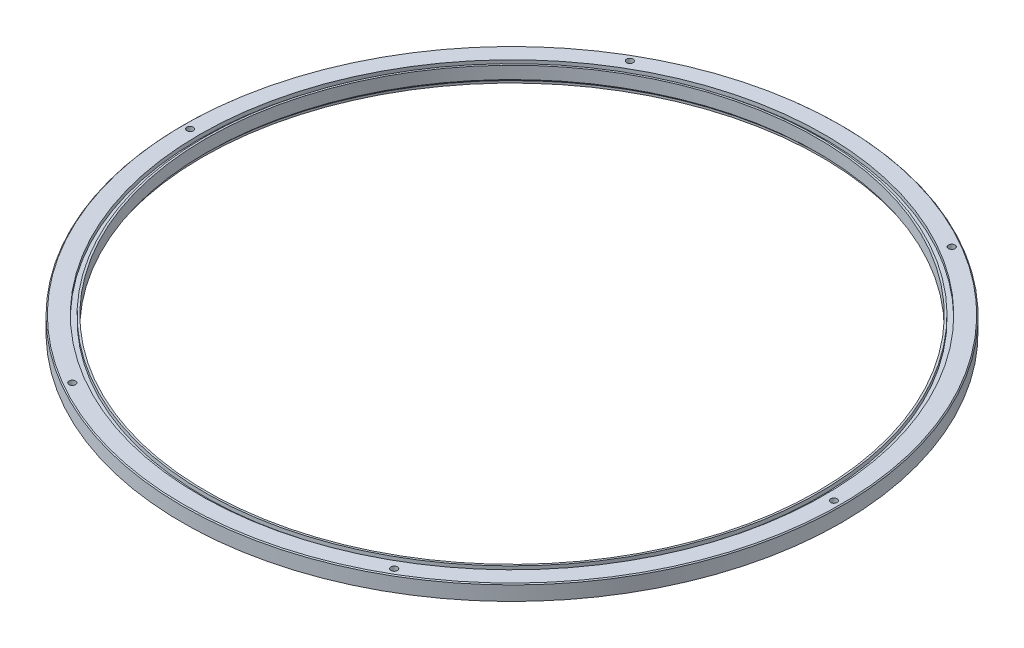
ISO-10303-21;
HEADER;
FILE_DESCRIPTION(('STEP AP214'),'2;1');
FILE_NAME('part.step','',(''),(''),'','','');
FILE_SCHEMA(('AUTOMOTIVE_DESIGN { 1 0 10303 214 1 1 1 1 }'));
ENDSEC;
DATA;
#1=APPLICATION_CONTEXT('core data for automotive mechanical design processes');
#2=APPLICATION_PROTOCOL_DEFINITION('international standard','automotive_design',2000,#1);
#3=PRODUCT_CONTEXT('',#1,'mechanical');
#4=PRODUCT('Part','Part','',(#3));
#5=PRODUCT_RELATED_PRODUCT_CATEGORY('part','',(#4));
#6=PRODUCT_DEFINITION_FORMATION('','',#4);
#7=PRODUCT_DEFINITION_CONTEXT('part definition',#1,'design');
#8=PRODUCT_DEFINITION('design','',#6,#7);
#9=PRODUCT_DEFINITION_SHAPE('','',#8);
#10=(LENGTH_UNIT() NAMED_UNIT(*) SI_UNIT(.MILLI.,.METRE.));
#11=(NAMED_UNIT(*) PLANE_ANGLE_UNIT() SI_UNIT($,.RADIAN.));
#12=(NAMED_UNIT(*) SI_UNIT($,.STERADIAN.) SOLID_ANGLE_UNIT());
#13=UNCERTAINTY_MEASURE_WITH_UNIT(LENGTH_MEASURE(1.E-05),#10,'distance_accuracy_value','');
#14=(GEOMETRIC_REPRESENTATION_CONTEXT(3) GLOBAL_UNCERTAINTY_ASSIGNED_CONTEXT((#13)) GLOBAL_UNIT_ASSIGNED_CONTEXT((#10,
#11,#12)) REPRESENTATION_CONTEXT('',''));
#15=CARTESIAN_POINT('',(0.,0.,0.));
#16=DIRECTION('',(0.,0.,1.));
#17=DIRECTION('',(1.,0.,0.));
#18=AXIS2_PLACEMENT_3D('',#15,#16,#17);
#19=CARTESIAN_POINT('',(0.,-0.95,0.));
#20=DIRECTION('',(0.,1.,0.));
#21=DIRECTION('',(1.,0.,0.));
#22=AXIS2_PLACEMENT_3D('',#19,#20,#21);
#23=CYLINDRICAL_SURFACE('',#22,345.);
#24=CARTESIAN_POINT('',(0.,18.00000000001,0.));
#25=DIRECTION('',(0.,1.,0.));
#26=DIRECTION('',(1.,0.,0.));
#27=AXIS2_PLACEMENT_3D('',#24,#25,#26);
#28=CIRCLE('',#27,345.);
#29=CARTESIAN_POINT('',(-345.,18.00000000001,0.));
#30=VERTEX_POINT('',#29);
#31=CARTESIAN_POINT('',(-1.20188274546653E-13,17.9999999999891,344.999999999979));
#32=VERTEX_POINT('',#31);
#33=EDGE_CURVE('E217',#30,#32,#28,.T.);
#34=ORIENTED_EDGE('',*,*,#33,.F.);
#35=DIRECTION('',(0.,-1.,0.));
#36=VECTOR('',#35,1.);
#37=CARTESIAN_POINT('',(-345.,-0.95,0.));
#38=LINE('',#37,#36);
#39=CARTESIAN_POINT('',(-345.,3.,0.));
#40=VERTEX_POINT('',#39);
#41=EDGE_CURVE('E11',#30,#40,#38,.T.);
#42=ORIENTED_EDGE('',*,*,#41,.T.);
#43=CARTESIAN_POINT('',(0.,3.,0.));
#44=DIRECTION('',(0.,-1.,0.));
#45=DIRECTION('',(1.,0.,0.));
#46=AXIS2_PLACEMENT_3D('',#43,#44,#45);
#47=CIRCLE('',#46,345.);
#48=EDGE_CURVE('E207',#40,#40,#47,.T.);
#49=ORIENTED_EDGE('',*,*,#48,.F.);
#50=ORIENTED_EDGE('',*,*,#41,.F.);
#51=CARTESIAN_POINT('',(0.,18.00000000001,0.));
#52=DIRECTION('',(0.,1.,0.));
#53=DIRECTION('',(1.,0.,0.));
#54=AXIS2_PLACEMENT_3D('',#51,#52,#53);
#55=CIRCLE('',#54,345.);
#56=EDGE_CURVE('E28',#32,#30,#55,.T.);
#57=ORIENTED_EDGE('',*,*,#56,.F.);
#58=EDGE_LOOP('',(#34,#42,#49,#50,#57));
#59=FACE_BOUND('',#58,.T.);
#60=ADVANCED_FACE('F17',(#59),#23,.T.);
#61=CARTESIAN_POINT('',(0.,18.50000000088,-1.181814550022E-11));
#62=DIRECTION('',(0.,-1.,0.));
#63=DIRECTION('',(0.,0.,-1.));
#64=AXIS2_PLACEMENT_3D('',#61,#62,#63);
#65=CONICAL_SURFACE('',#64,344.4999999991,0.785398163397448);
#66=ORIENTED_EDGE('',*,*,#33,.T.);
#67=DIRECTION('',(0.,0.707106781186548,-0.707106781186548));
#68=VECTOR('',#67,1.);
#69=CARTESIAN_POINT('',(-1.20127042206586E-13,18.50000000088,344.499999999088));
#70=LINE('',#69,#68);
#71=CARTESIAN_POINT('',(-1.20065809866738E-13,18.9999999999901,343.999999999978));
#72=VERTEX_POINT('',#71);
#73=EDGE_CURVE('E220',#32,#72,#70,.T.);
#74=ORIENTED_EDGE('',*,*,#73,.T.);
#75=CARTESIAN_POINT('',(0.,19.,-1.181814550022E-11));
#76=DIRECTION('',(0.,1.,0.));
#77=DIRECTION('',(1.,0.,0.));
#78=AXIS2_PLACEMENT_3D('',#75,#76,#77);
#79=CIRCLE('',#78,344.);
#80=EDGE_CURVE('E209',#72,#72,#79,.T.);
#81=ORIENTED_EDGE('',*,*,#80,.F.);
#82=ORIENTED_EDGE('',*,*,#73,.F.);
#83=ORIENTED_EDGE('',*,*,#56,.T.);
#84=EDGE_LOOP('',(#66,#74,#81,#82,#83));
#85=FACE_BOUND('',#84,.T.);
#86=ADVANCED_FACE('F417',(#85),#65,.T.);
#87=CARTESIAN_POINT('',(168.5,-2.945,291.8505610754));
#88=DIRECTION('',(0.,1.,0.));
#89=DIRECTION('',(0.500000000000017,0.,0.866025403784429));
#90=AXIS2_PLACEMENT_3D('',#87,#88,#89);
#91=CYLINDRICAL_SURFACE('',#90,3.4);
#92=CARTESIAN_POINT('',(168.5,3.,291.8505610754));
#93=DIRECTION('',(0.,1.,0.));
#94=DIRECTION('',(0.500000000000017,0.,0.866025403784429));
#95=AXIS2_PLACEMENT_3D('',#92,#93,#94);
#96=CIRCLE('',#95,3.4);
#97=CARTESIAN_POINT('',(166.8,3.,288.9060747025));
#98=VERTEX_POINT('',#97);
#99=EDGE_CURVE('E245',#98,#98,#96,.T.);
#100=ORIENTED_EDGE('',*,*,#99,.F.);
#101=DIRECTION('',(0.,1.,0.));
#102=VECTOR('',#101,1.);
#103=CARTESIAN_POINT('',(166.8,-2.945,288.906074702533));
#104=LINE('',#103,#102);
#105=CARTESIAN_POINT('',(166.8,19.,288.9060747025));
#106=VERTEX_POINT('',#105);
#107=EDGE_CURVE('E221',#98,#106,#104,.T.);
#108=ORIENTED_EDGE('',*,*,#107,.T.);
#109=CARTESIAN_POINT('',(168.5,19.,291.8505610754));
#110=DIRECTION('',(0.,1.,0.));
#111=DIRECTION('',(0.500000000000017,0.,0.866025403784429));
#112=AXIS2_PLACEMENT_3D('',#109,#110,#111);
#113=CIRCLE('',#112,3.4);
#114=EDGE_CURVE('E203',#106,#106,#113,.T.);
#115=ORIENTED_EDGE('',*,*,#114,.T.);
#116=ORIENTED_EDGE('',*,*,#107,.F.);
#117=EDGE_LOOP('',(#100,#108,#115,#116));
#118=FACE_BOUND('',#117,.T.);
#119=ADVANCED_FACE('F455',(#118),#91,.F.);
#120=CARTESIAN_POINT('',(-168.5,-2.945,291.8505610754));
#121=DIRECTION('',(0.,1.,0.));
#122=DIRECTION('',(-0.500000000000017,0.,0.866025403784429));
#123=AXIS2_PLACEMENT_3D('',#120,#121,#122);
#124=CYLINDRICAL_SURFACE('',#123,3.4);
#125=CARTESIAN_POINT('',(-168.5,3.,291.8505610754));
#126=DIRECTION('',(0.,1.,0.));
#127=DIRECTION('',(-0.500000000000017,0.,0.866025403784429));
#128=AXIS2_PLACEMENT_3D('',#125,#126,#127);
#129=CIRCLE('',#128,3.4);
#130=CARTESIAN_POINT('',(-166.8,3.,288.9060747025));
#131=VERTEX_POINT('',#130);
#132=EDGE_CURVE('E241',#131,#131,#129,.T.);
#133=ORIENTED_EDGE('',*,*,#132,.F.);
#134=DIRECTION('',(0.,1.,0.));
#135=VECTOR('',#134,1.);
#136=CARTESIAN_POINT('',(-166.8,-2.945,288.906074702533));
#137=LINE('',#136,#135);
#138=CARTESIAN_POINT('',(-166.8,19.,288.9060747025));
#139=VERTEX_POINT('',#138);
#140=EDGE_CURVE('E228',#131,#139,#137,.T.);
#141=ORIENTED_EDGE('',*,*,#140,.T.);
#142=CARTESIAN_POINT('',(-168.5,19.,291.8505610754));
#143=DIRECTION('',(0.,1.,0.));
#144=DIRECTION('',(-0.500000000000017,0.,0.866025403784429));
#145=AXIS2_PLACEMENT_3D('',#142,#143,#144);
#146=CIRCLE('',#145,3.4);
#147=EDGE_CURVE('E199',#139,#139,#146,.T.);
#148=ORIENTED_EDGE('',*,*,#147,.T.);
#149=ORIENTED_EDGE('',*,*,#140,.F.);
#150=EDGE_LOOP('',(#133,#141,#148,#149));
#151=FACE_BOUND('',#150,.T.);
#152=ADVANCED_FACE('F377',(#151),#124,.F.);
#153=CARTESIAN_POINT('',(-337.,-2.945,0.));
#154=DIRECTION('',(0.,1.,0.));
#155=DIRECTION('',(-1.,0.,0.));
#156=AXIS2_PLACEMENT_3D('',#153,#154,#155);
#157=CYLINDRICAL_SURFACE('',#156,3.4);
#158=CARTESIAN_POINT('',(-337.,3.,0.));
#159=DIRECTION('',(0.,1.,0.));
#160=DIRECTION('',(-1.,0.,0.));
#161=AXIS2_PLACEMENT_3D('',#158,#159,#160);
#162=CIRCLE('',#161,3.4);
#163=CARTESIAN_POINT('',(-333.6,3.,0.));
#164=VERTEX_POINT('',#163);
#165=EDGE_CURVE('E246',#164,#164,#162,.T.);
#166=ORIENTED_EDGE('',*,*,#165,.F.);
#167=DIRECTION('',(0.,1.,0.));
#168=VECTOR('',#167,1.);
#169=CARTESIAN_POINT('',(-333.6,-2.945,0.));
#170=LINE('',#169,#168);
#171=CARTESIAN_POINT('',(-333.6,19.,0.));
#172=VERTEX_POINT('',#171);
#173=EDGE_CURVE('E235',#164,#172,#170,.T.);
#174=ORIENTED_EDGE('',*,*,#173,.T.);
#175=CARTESIAN_POINT('',(-337.,19.,0.));
#176=DIRECTION('',(0.,1.,0.));
#177=DIRECTION('',(-1.,0.,0.));
#178=AXIS2_PLACEMENT_3D('',#175,#176,#177);
#179=CIRCLE('',#178,3.4);
#180=EDGE_CURVE('E191',#172,#172,#179,.T.);
#181=ORIENTED_EDGE('',*,*,#180,.T.);
#182=ORIENTED_EDGE('',*,*,#173,.F.);
#183=EDGE_LOOP('',(#166,#174,#181,#182));
#184=FACE_BOUND('',#183,.T.);
#185=ADVANCED_FACE('F371',(#184),#157,.F.);
#186=CARTESIAN_POINT('',(-168.5,-2.945,-291.8505610754));
#187=DIRECTION('',(0.,1.,0.));
#188=DIRECTION('',(-0.500000000000017,0.,-0.866025403784429));
#189=AXIS2_PLACEMENT_3D('',#186,#187,#188);
#190=CYLINDRICAL_SURFACE('',#189,3.4);
#191=CARTESIAN_POINT('',(-168.5,3.,-291.8505610754));
#192=DIRECTION('',(0.,1.,0.));
#193=DIRECTION('',(-0.500000000000017,0.,-0.866025403784429));
#194=AXIS2_PLACEMENT_3D('',#191,#192,#193);
#195=CIRCLE('',#194,3.4);
#196=CARTESIAN_POINT('',(-166.8,3.,-288.9060747025));
#197=VERTEX_POINT('',#196);
#198=EDGE_CURVE('E264',#197,#197,#195,.T.);
#199=ORIENTED_EDGE('',*,*,#198,.F.);
#200=DIRECTION('',(0.,1.,0.));
#201=VECTOR('',#200,1.);
#202=CARTESIAN_POINT('',(-166.8,-2.945,-288.906074702533));
#203=LINE('',#202,#201);
#204=CARTESIAN_POINT('',(-166.8,19.,-288.9060747025));
#205=VERTEX_POINT('',#204);
#206=EDGE_CURVE('E257',#197,#205,#203,.T.);
#207=ORIENTED_EDGE('',*,*,#206,.T.);
#208=CARTESIAN_POINT('',(-168.5,19.,-291.8505610754));
#209=DIRECTION('',(0.,1.,0.));
#210=DIRECTION('',(-0.500000000000017,0.,-0.866025403784429));
#211=AXIS2_PLACEMENT_3D('',#208,#209,#210);
#212=CIRCLE('',#211,3.4);
#213=EDGE_CURVE('E188',#205,#205,#212,.T.);
#214=ORIENTED_EDGE('',*,*,#213,.T.);
#215=ORIENTED_EDGE('',*,*,#206,.F.);
#216=EDGE_LOOP('',(#199,#207,#214,#215));
#217=FACE_BOUND('',#216,.T.);
#218=ADVANCED_FACE('F376',(#217),#190,.F.);
#219=CARTESIAN_POINT('',(168.5,-2.945,-291.8505610754));
#220=DIRECTION('',(0.,1.,0.));
#221=DIRECTION('',(0.500000000000017,0.,-0.866025403784429));
#222=AXIS2_PLACEMENT_3D('',#219,#220,#221);
#223=CYLINDRICAL_SURFACE('',#222,3.4);
#224=CARTESIAN_POINT('',(168.5,3.,-291.8505610754));
#225=DIRECTION('',(0.,1.,0.));
#226=DIRECTION('',(0.500000000000017,0.,-0.866025403784429));
#227=AXIS2_PLACEMENT_3D('',#224,#225,#226);
#228=CIRCLE('',#227,3.4);
#229=CARTESIAN_POINT('',(166.8,3.,-288.9060747025));
#230=VERTEX_POINT('',#229);
#231=EDGE_CURVE('E268',#230,#230,#228,.T.);
#232=ORIENTED_EDGE('',*,*,#231,.F.);
#233=DIRECTION('',(0.,1.,0.));
#234=VECTOR('',#233,1.);
#235=CARTESIAN_POINT('',(166.8,-2.945,-288.906074702533));
#236=LINE('',#235,#234);
#237=CARTESIAN_POINT('',(166.8,19.,-288.9060747025));
#238=VERTEX_POINT('',#237);
#239=EDGE_CURVE('E260',#230,#238,#236,.T.);
#240=ORIENTED_EDGE('',*,*,#239,.T.);
#241=CARTESIAN_POINT('',(168.5,19.,-291.8505610754));
#242=DIRECTION('',(0.,1.,0.));
#243=DIRECTION('',(0.500000000000017,0.,-0.866025403784429));
#244=AXIS2_PLACEMENT_3D('',#241,#242,#243);
#245=CIRCLE('',#244,3.4);
#246=EDGE_CURVE('E192',#238,#238,#245,.T.);
#247=ORIENTED_EDGE('',*,*,#246,.T.);
#248=ORIENTED_EDGE('',*,*,#239,.F.);
#249=EDGE_LOOP('',(#232,#240,#247,#248));
#250=FACE_BOUND('',#249,.T.);
#251=ADVANCED_FACE('F364',(#250),#223,.F.);
#252=CARTESIAN_POINT('',(337.,-2.945,0.));
#253=DIRECTION('',(0.,1.,0.));
#254=DIRECTION('',(1.,0.,0.));
#255=AXIS2_PLACEMENT_3D('',#252,#253,#254);
#256=CYLINDRICAL_SURFACE('',#255,3.4);
#257=CARTESIAN_POINT('',(337.,3.,0.));
#258=DIRECTION('',(0.,1.,0.));
#259=DIRECTION('',(1.,0.,0.));
#260=AXIS2_PLACEMENT_3D('',#257,#258,#259);
#261=CIRCLE('',#260,3.4);
#262=CARTESIAN_POINT('',(333.6,3.,0.));
#263=VERTEX_POINT('',#262);
#264=EDGE_CURVE('E186',#263,#263,#261,.T.);
#265=ORIENTED_EDGE('',*,*,#264,.F.);
#266=DIRECTION('',(0.,1.,0.));
#267=VECTOR('',#266,1.);
#268=CARTESIAN_POINT('',(333.6,-2.945,0.));
#269=LINE('',#268,#267);
#270=CARTESIAN_POINT('',(333.6,19.,0.));
#271=VERTEX_POINT('',#270);
#272=EDGE_CURVE('E269',#263,#271,#269,.T.);
#273=ORIENTED_EDGE('',*,*,#272,.T.);
#274=CARTESIAN_POINT('',(337.,19.,0.));
#275=DIRECTION('',(0.,1.,0.));
#276=DIRECTION('',(1.,0.,0.));
#277=AXIS2_PLACEMENT_3D('',#274,#275,#276);
#278=CIRCLE('',#277,3.4);
#279=EDGE_CURVE('E213',#271,#271,#278,.T.);
#280=ORIENTED_EDGE('',*,*,#279,.T.);
#281=ORIENTED_EDGE('',*,*,#272,.F.);
#282=EDGE_LOOP('',(#265,#273,#280,#281));
#283=FACE_BOUND('',#282,.T.);
#284=ADVANCED_FACE('F358',(#283),#256,.F.);
#285=CARTESIAN_POINT('',(0.,19.,0.));
#286=DIRECTION('',(0.,1.,0.));
#287=DIRECTION('',(1.,0.,0.));
#288=AXIS2_PLACEMENT_3D('',#285,#286,#287);
#289=PLANE('',#288);
#290=CARTESIAN_POINT('',(0.,19.,0.));
#291=DIRECTION('',(0.,1.,0.));
#292=DIRECTION('',(1.,0.,0.));
#293=AXIS2_PLACEMENT_3D('',#290,#291,#292);
#294=CIRCLE('',#293,327.);
#295=CARTESIAN_POINT('',(-327.,19.,0.));
#296=VERTEX_POINT('',#295);
#297=EDGE_CURVE('E214',#296,#296,#294,.T.);
#298=ORIENTED_EDGE('',*,*,#297,.F.);
#299=EDGE_LOOP('',(#298));
#300=FACE_BOUND('',#299,.T.);
#301=ORIENTED_EDGE('',*,*,#114,.F.);
#302=EDGE_LOOP('',(#301));
#303=FACE_BOUND('',#302,.T.);
#304=ORIENTED_EDGE('',*,*,#147,.F.);
#305=EDGE_LOOP('',(#304));
#306=FACE_BOUND('',#305,.T.);
#307=ORIENTED_EDGE('',*,*,#180,.F.);
#308=EDGE_LOOP('',(#307));
#309=FACE_BOUND('',#308,.T.);
#310=ORIENTED_EDGE('',*,*,#213,.F.);
#311=EDGE_LOOP('',(#310));
#312=FACE_BOUND('',#311,.T.);
#313=ORIENTED_EDGE('',*,*,#246,.F.);
#314=EDGE_LOOP('',(#313));
#315=FACE_BOUND('',#314,.T.);
#316=ORIENTED_EDGE('',*,*,#279,.F.);
#317=EDGE_LOOP('',(#316));
#318=FACE_BOUND('',#317,.T.);
#319=ORIENTED_EDGE('',*,*,#80,.T.);
#320=EDGE_LOOP('',(#319));
#321=FACE_BOUND('',#320,.T.);
#322=ADVANCED_FACE('F363',(#300,#303,#306,#309,#312,#315,#318,#321),#289,.T.);
#323=CARTESIAN_POINT('',(0.,-0.95,0.));
#324=DIRECTION('',(0.,1.,0.));
#325=DIRECTION('',(1.,0.,0.));
#326=AXIS2_PLACEMENT_3D('',#323,#324,#325);
#327=CYLINDRICAL_SURFACE('',#326,327.);
#328=CARTESIAN_POINT('',(0.,15.,0.));
#329=DIRECTION('',(0.,1.,0.));
#330=DIRECTION('',(1.,0.,0.));
#331=AXIS2_PLACEMENT_3D('',#328,#329,#330);
#332=CIRCLE('',#331,327.);
#333=CARTESIAN_POINT('',(-327.,15.,0.));
#334=VERTEX_POINT('',#333);
#335=EDGE_CURVE('E21',#334,#334,#332,.T.);
#336=ORIENTED_EDGE('',*,*,#335,.F.);
#337=DIRECTION('',(0.,1.,0.));
#338=VECTOR('',#337,1.);
#339=CARTESIAN_POINT('',(-327.,-0.95,0.));
#340=LINE('',#339,#338);
#341=EDGE_CURVE('E240',#334,#296,#340,.T.);
#342=ORIENTED_EDGE('',*,*,#341,.T.);
#343=ORIENTED_EDGE('',*,*,#297,.T.);
#344=ORIENTED_EDGE('',*,*,#341,.F.);
#345=EDGE_LOOP('',(#336,#342,#343,#344));
#346=FACE_BOUND('',#345,.T.);
#347=ADVANCED_FACE('F391',(#346),#327,.F.);
#348=CARTESIAN_POINT('',(0.,15.,0.));
#349=DIRECTION('',(0.,1.,0.));
#350=DIRECTION('',(1.,0.,0.));
#351=AXIS2_PLACEMENT_3D('',#348,#349,#350);
#352=PLANE('',#351);
#353=CARTESIAN_POINT('',(0.,15.,0.));
#354=DIRECTION('',(0.,1.,0.));
#355=DIRECTION('',(1.,0.,0.));
#356=AXIS2_PLACEMENT_3D('',#353,#354,#355);
#357=CIRCLE('',#356,322.);
#358=CARTESIAN_POINT('',(-322.,15.,0.));
#359=VERTEX_POINT('',#358);
#360=EDGE_CURVE('E135',#359,#359,#357,.T.);
#361=ORIENTED_EDGE('',*,*,#360,.F.);
#362=EDGE_LOOP('',(#361));
#363=FACE_BOUND('',#362,.T.);
#364=ORIENTED_EDGE('',*,*,#335,.T.);
#365=EDGE_LOOP('',(#364));
#366=FACE_BOUND('',#365,.T.);
#367=ADVANCED_FACE('F396',(#363,#366),#352,.T.);
#368=CARTESIAN_POINT('',(0.,-0.95,0.));
#369=DIRECTION('',(0.,1.,0.));
#370=DIRECTION('',(1.,0.,0.));
#371=AXIS2_PLACEMENT_3D('',#368,#369,#370);
#372=CYLINDRICAL_SURFACE('',#371,322.);
#373=CARTESIAN_POINT('',(0.,19.,0.));
#374=DIRECTION('',(0.,1.,0.));
#375=DIRECTION('',(1.,0.,0.));
#376=AXIS2_PLACEMENT_3D('',#373,#374,#375);
#377=CIRCLE('',#376,322.);
#378=CARTESIAN_POINT('',(-322.,19.,0.));
#379=VERTEX_POINT('',#378);
#380=EDGE_CURVE('E194',#379,#379,#377,.T.);
#381=ORIENTED_EDGE('',*,*,#380,.F.);
#382=DIRECTION('',(0.,-1.,0.));
#383=VECTOR('',#382,1.);
#384=CARTESIAN_POINT('',(-322.,-0.95,0.));
#385=LINE('',#384,#383);
#386=EDGE_CURVE('E139',#379,#359,#385,.T.);
#387=ORIENTED_EDGE('',*,*,#386,.T.);
#388=ORIENTED_EDGE('',*,*,#360,.T.);
#389=ORIENTED_EDGE('',*,*,#386,.F.);
#390=EDGE_LOOP('',(#381,#387,#388,#389));
#391=FACE_BOUND('',#390,.T.);
#392=ADVANCED_FACE('F443',(#391),#372,.T.);
#393=CARTESIAN_POINT('',(0.,19.,0.));
#394=DIRECTION('',(0.,1.,0.));
#395=DIRECTION('',(1.,0.,0.));
#396=AXIS2_PLACEMENT_3D('',#393,#394,#395);
#397=PLANE('',#396);
#398=CARTESIAN_POINT('',(0.,19.,0.));
#399=DIRECTION('',(0.,1.,0.));
#400=DIRECTION('',(1.,0.,0.));
#401=AXIS2_PLACEMENT_3D('',#398,#399,#400);
#402=CIRCLE('',#401,320.);
#403=CARTESIAN_POINT('',(-320.,19.,0.));
#404=VERTEX_POINT('',#403);
#405=EDGE_CURVE('E150',#404,#404,#402,.T.);
#406=ORIENTED_EDGE('',*,*,#405,.F.);
#407=EDGE_LOOP('',(#406));
#408=FACE_BOUND('',#407,.T.);
#409=ORIENTED_EDGE('',*,*,#380,.T.);
#410=EDGE_LOOP('',(#409));
#411=FACE_BOUND('',#410,.T.);
#412=ADVANCED_FACE('F438',(#408,#411),#397,.T.);
#413=CARTESIAN_POINT('',(0.,-0.95,0.));
#414=DIRECTION('',(0.,1.,0.));
#415=DIRECTION('',(1.,0.,0.));
#416=AXIS2_PLACEMENT_3D('',#413,#414,#415);
#417=CYLINDRICAL_SURFACE('',#416,320.);
#418=CARTESIAN_POINT('',(0.,6.,0.));
#419=DIRECTION('',(0.,1.,0.));
#420=DIRECTION('',(-1.,0.,0.));
#421=AXIS2_PLACEMENT_3D('',#418,#419,#420);
#422=CIRCLE('',#421,320.);
#423=CARTESIAN_POINT('',(0.,5.99999999999906,320.));
#424=VERTEX_POINT('',#423);
#425=CARTESIAN_POINT('',(-320.,6.,0.));
#426=VERTEX_POINT('',#425);
#427=EDGE_CURVE('E165',#424,#426,#422,.T.);
#428=ORIENTED_EDGE('',*,*,#427,.F.);
#429=CARTESIAN_POINT('',(0.,6.,0.));
#430=DIRECTION('',(0.,1.,0.));
#431=DIRECTION('',(-1.,0.,0.));
#432=AXIS2_PLACEMENT_3D('',#429,#430,#431);
#433=CIRCLE('',#432,320.);
#434=EDGE_CURVE('E170',#426,#424,#433,.T.);
#435=ORIENTED_EDGE('',*,*,#434,.F.);
#436=DIRECTION('',(0.,1.,0.));
#437=VECTOR('',#436,1.);
#438=CARTESIAN_POINT('',(-320.,-0.95,0.));
#439=LINE('',#438,#437);
#440=EDGE_CURVE('E169',#426,#404,#439,.T.);
#441=ORIENTED_EDGE('',*,*,#440,.T.);
#442=ORIENTED_EDGE('',*,*,#405,.T.);
#443=ORIENTED_EDGE('',*,*,#440,.F.);
#444=EDGE_LOOP('',(#428,#435,#441,#442,#443));
#445=FACE_BOUND('',#444,.T.);
#446=ADVANCED_FACE('F175',(#445),#417,.F.);
#447=CARTESIAN_POINT('',(0.,4.500000001398,0.));
#448=DIRECTION('',(0.,-1.,0.));
#449=DIRECTION('',(0.,0.,-1.));
#450=AXIS2_PLACEMENT_3D('',#447,#448,#449);
#451=CONICAL_SURFACE('',#450,321.4999999986,0.785398163397448);
#452=ORIENTED_EDGE('',*,*,#427,.T.);
#453=ORIENTED_EDGE('',*,*,#434,.T.);
#454=DIRECTION('',(0.,-0.707106781186548,0.707106781186548));
#455=VECTOR('',#454,1.);
#456=CARTESIAN_POINT('',(0.,4.500000001398,321.4999999986));
#457=LINE('',#456,#455);
#458=CARTESIAN_POINT('',(0.,2.99999999999895,323.));
#459=VERTEX_POINT('',#458);
#460=EDGE_CURVE('E161',#424,#459,#457,.T.);
#461=ORIENTED_EDGE('',*,*,#460,.T.);
#462=CARTESIAN_POINT('',(0.,3.,0.));
#463=DIRECTION('',(0.,1.,0.));
#464=DIRECTION('',(-1.,0.,0.));
#465=AXIS2_PLACEMENT_3D('',#462,#463,#464);
#466=CIRCLE('',#465,323.);
#467=EDGE_CURVE('E167',#459,#459,#466,.T.);
#468=ORIENTED_EDGE('',*,*,#467,.F.);
#469=ORIENTED_EDGE('',*,*,#460,.F.);
#470=EDGE_LOOP('',(#452,#453,#461,#468,#469));
#471=FACE_BOUND('',#470,.T.);
#472=ADVANCED_FACE('F163',(#471),#451,.F.);
#473=CARTESIAN_POINT('',(0.,3.,0.));
#474=DIRECTION('',(0.,1.,0.));
#475=DIRECTION('',(1.,0.,0.));
#476=AXIS2_PLACEMENT_3D('',#473,#474,#475);
#477=PLANE('',#476);
#478=ORIENTED_EDGE('',*,*,#467,.T.);
#479=EDGE_LOOP('',(#478));
#480=FACE_BOUND('',#479,.T.);
#481=CARTESIAN_POINT('',(0.,3.,0.));
#482=DIRECTION('',(0.,1.,0.));
#483=DIRECTION('',(1.,0.,0.));
#484=AXIS2_PLACEMENT_3D('',#481,#482,#483);
#485=CIRCLE('',#484,324.);
#486=CARTESIAN_POINT('',(-324.,3.,0.));
#487=VERTEX_POINT('',#486);
#488=EDGE_CURVE('E182',#487,#487,#485,.T.);
#489=ORIENTED_EDGE('',*,*,#488,.F.);
#490=EDGE_LOOP('',(#489));
#491=FACE_BOUND('',#490,.T.);
#492=ADVANCED_FACE('F347',(#480,#491),#477,.F.);
#493=CARTESIAN_POINT('',(0.,-0.95,0.));
#494=DIRECTION('',(0.,1.,0.));
#495=DIRECTION('',(1.,0.,0.));
#496=AXIS2_PLACEMENT_3D('',#493,#494,#495);
#497=CYLINDRICAL_SURFACE('',#496,324.);
#498=CARTESIAN_POINT('',(0.,0.,0.));
#499=DIRECTION('',(0.,1.,0.));
#500=DIRECTION('',(1.,0.,0.));
#501=AXIS2_PLACEMENT_3D('',#498,#499,#500);
#502=CIRCLE('',#501,324.);
#503=CARTESIAN_POINT('',(-324.,0.,0.));
#504=VERTEX_POINT('',#503);
#505=EDGE_CURVE('E255',#504,#504,#502,.T.);
#506=ORIENTED_EDGE('',*,*,#505,.F.);
#507=DIRECTION('',(0.,1.,0.));
#508=VECTOR('',#507,1.);
#509=CARTESIAN_POINT('',(-324.,-0.95,0.));
#510=LINE('',#509,#508);
#511=EDGE_CURVE('E281',#504,#487,#510,.T.);
#512=ORIENTED_EDGE('',*,*,#511,.T.);
#513=ORIENTED_EDGE('',*,*,#488,.T.);
#514=ORIENTED_EDGE('',*,*,#511,.F.);
#515=EDGE_LOOP('',(#506,#512,#513,#514));
#516=FACE_BOUND('',#515,.T.);
#517=ADVANCED_FACE('F19',(#516),#497,.F.);
#518=CARTESIAN_POINT('',(0.,0.,0.));
#519=DIRECTION('',(0.,1.,0.));
#520=DIRECTION('',(1.,0.,0.));
#521=AXIS2_PLACEMENT_3D('',#518,#519,#520);
#522=PLANE('',#521);
#523=ORIENTED_EDGE('',*,*,#505,.T.);
#524=EDGE_LOOP('',(#523));
#525=FACE_BOUND('',#524,.T.);
#526=CARTESIAN_POINT('',(0.,0.,0.));
#527=DIRECTION('',(0.,1.,0.));
#528=DIRECTION('',(1.,0.,0.));
#529=AXIS2_PLACEMENT_3D('',#526,#527,#528);
#530=CIRCLE('',#529,327.);
#531=CARTESIAN_POINT('',(-327.,0.,0.));
#532=VERTEX_POINT('',#531);
#533=EDGE_CURVE('E253',#532,#532,#530,.T.);
#534=ORIENTED_EDGE('',*,*,#533,.F.);
#535=EDGE_LOOP('',(#534));
#536=FACE_BOUND('',#535,.T.);
#537=ADVANCED_FACE('F402',(#525,#536),#522,.F.);
#538=CARTESIAN_POINT('',(0.,-0.95,0.));
#539=DIRECTION('',(0.,1.,0.));
#540=DIRECTION('',(1.,0.,0.));
#541=AXIS2_PLACEMENT_3D('',#538,#539,#540);
#542=CYLINDRICAL_SURFACE('',#541,327.);
#543=CARTESIAN_POINT('',(0.,3.,0.));
#544=DIRECTION('',(0.,1.,0.));
#545=DIRECTION('',(1.,0.,0.));
#546=AXIS2_PLACEMENT_3D('',#543,#544,#545);
#547=CIRCLE('',#546,327.);
#548=CARTESIAN_POINT('',(-327.,3.,0.));
#549=VERTEX_POINT('',#548);
#550=EDGE_CURVE('E204',#549,#549,#547,.T.);
#551=ORIENTED_EDGE('',*,*,#550,.F.);
#552=DIRECTION('',(0.,-1.,0.));
#553=VECTOR('',#552,1.);
#554=CARTESIAN_POINT('',(-327.,-0.95,0.));
#555=LINE('',#554,#553);
#556=EDGE_CURVE('E250',#549,#532,#555,.T.);
#557=ORIENTED_EDGE('',*,*,#556,.T.);
#558=ORIENTED_EDGE('',*,*,#533,.T.);
#559=ORIENTED_EDGE('',*,*,#556,.F.);
#560=EDGE_LOOP('',(#551,#557,#558,#559));
#561=FACE_BOUND('',#560,.T.);
#562=ADVANCED_FACE('F407',(#561),#542,.T.);
#563=CARTESIAN_POINT('',(0.,3.,0.));
#564=DIRECTION('',(0.,1.,0.));
#565=DIRECTION('',(1.,0.,0.));
#566=AXIS2_PLACEMENT_3D('',#563,#564,#565);
#567=PLANE('',#566);
#568=ORIENTED_EDGE('',*,*,#99,.T.);
#569=EDGE_LOOP('',(#568));
#570=FACE_BOUND('',#569,.T.);
#571=ORIENTED_EDGE('',*,*,#132,.T.);
#572=EDGE_LOOP('',(#571));
#573=FACE_BOUND('',#572,.T.);
#574=ORIENTED_EDGE('',*,*,#165,.T.);
#575=EDGE_LOOP('',(#574));
#576=FACE_BOUND('',#575,.T.);
#577=ORIENTED_EDGE('',*,*,#198,.T.);
#578=EDGE_LOOP('',(#577));
#579=FACE_BOUND('',#578,.T.);
#580=ORIENTED_EDGE('',*,*,#231,.T.);
#581=EDGE_LOOP('',(#580));
#582=FACE_BOUND('',#581,.T.);
#583=ORIENTED_EDGE('',*,*,#264,.T.);
#584=EDGE_LOOP('',(#583));
#585=FACE_BOUND('',#584,.T.);
#586=ORIENTED_EDGE('',*,*,#550,.T.);
#587=EDGE_LOOP('',(#586));
#588=FACE_BOUND('',#587,.T.);
#589=ORIENTED_EDGE('',*,*,#48,.T.);
#590=EDGE_LOOP('',(#589));
#591=FACE_BOUND('',#590,.T.);
#592=ADVANCED_FACE('F425',(#570,#573,#576,#579,#582,#585,#588,#591),#567,.F.);
#593=CLOSED_SHELL('',(#60,#86,#119,#152,#185,#218,#251,#284,#322,#347,#367,#392,#412,#446,#472,
#492,#517,#537,#562,#592));
#594=MANIFOLD_SOLID_BREP('B1',#593);
#595=ADVANCED_BREP_SHAPE_REPRESENTATION('',(#18,#594),#14);
#596=SHAPE_DEFINITION_REPRESENTATION(#9,#595);
ENDSEC;
END-ISO-10303-21;
